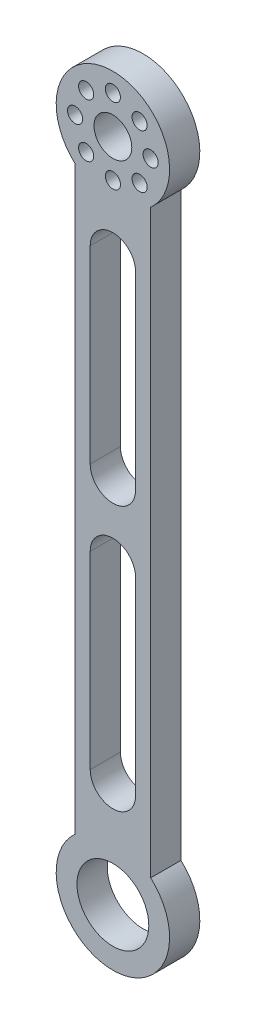
ISO-10303-21;
HEADER;
FILE_DESCRIPTION(('STEP AP214'),'2;1');
FILE_NAME('part.step','',(''),(''),'','','');
FILE_SCHEMA(('AUTOMOTIVE_DESIGN { 1 0 10303 214 1 1 1 1 }'));
ENDSEC;
DATA;
#1=APPLICATION_CONTEXT('core data for automotive mechanical design processes');
#2=APPLICATION_PROTOCOL_DEFINITION('international standard','automotive_design',2000,#1);
#3=PRODUCT_CONTEXT('',#1,'mechanical');
#4=PRODUCT('Part','Part','',(#3));
#5=PRODUCT_RELATED_PRODUCT_CATEGORY('part','',(#4));
#6=PRODUCT_DEFINITION_FORMATION('','',#4);
#7=PRODUCT_DEFINITION_CONTEXT('part definition',#1,'design');
#8=PRODUCT_DEFINITION('design','',#6,#7);
#9=PRODUCT_DEFINITION_SHAPE('','',#8);
#10=(LENGTH_UNIT() NAMED_UNIT(*) SI_UNIT(.MILLI.,.METRE.));
#11=(NAMED_UNIT(*) PLANE_ANGLE_UNIT() SI_UNIT($,.RADIAN.));
#12=(NAMED_UNIT(*) SI_UNIT($,.STERADIAN.) SOLID_ANGLE_UNIT());
#13=UNCERTAINTY_MEASURE_WITH_UNIT(LENGTH_MEASURE(1.E-05),#10,'distance_accuracy_value','');
#14=(GEOMETRIC_REPRESENTATION_CONTEXT(3) GLOBAL_UNCERTAINTY_ASSIGNED_CONTEXT((#13)) GLOBAL_UNIT_ASSIGNED_CONTEXT((#10,
#11,#12)) REPRESENTATION_CONTEXT('',''));
#15=CARTESIAN_POINT('',(0.,0.,0.));
#16=DIRECTION('',(0.,0.,1.));
#17=DIRECTION('',(1.,0.,0.));
#18=AXIS2_PLACEMENT_3D('',#15,#16,#17);
#19=CARTESIAN_POINT('',(6.,0.,-2.));
#20=DIRECTION('',(1.,0.,0.));
#21=DIRECTION('',(0.,0.,-1.));
#22=AXIS2_PLACEMENT_3D('',#19,#20,#21);
#23=PLANE('',#22);
#24=DIRECTION('',(0.,0.,1.));
#25=VECTOR('',#24,1.);
#26=CARTESIAN_POINT('',(6.,10.,0.));
#27=LINE('',#26,#25);
#28=CARTESIAN_POINT('',(6.,9.99999999999999,0.));
#29=VERTEX_POINT('',#28);
#30=CARTESIAN_POINT('',(6.,10.,8.));
#31=VERTEX_POINT('',#30);
#32=EDGE_CURVE('E133',#29,#31,#27,.T.);
#33=ORIENTED_EDGE('',*,*,#32,.T.);
#34=DIRECTION('',(0.,1.,0.));
#35=VECTOR('',#34,1.);
#36=CARTESIAN_POINT('',(6.,0.,8.));
#37=LINE('',#36,#35);
#38=CARTESIAN_POINT('',(6.,60.,8.));
#39=VERTEX_POINT('',#38);
#40=EDGE_CURVE('E171',#31,#39,#37,.T.);
#41=ORIENTED_EDGE('',*,*,#40,.T.);
#42=DIRECTION('',(0.,0.,1.));
#43=VECTOR('',#42,1.);
#44=CARTESIAN_POINT('',(6.,60.,-2.));
#45=LINE('',#44,#43);
#46=CARTESIAN_POINT('',(6.,60.,0.));
#47=VERTEX_POINT('',#46);
#48=EDGE_CURVE('E168',#47,#39,#45,.T.);
#49=ORIENTED_EDGE('',*,*,#48,.F.);
#50=DIRECTION('',(0.,1.,0.));
#51=VECTOR('',#50,1.);
#52=CARTESIAN_POINT('',(6.,-87.9999999999999,0.));
#53=LINE('',#52,#51);
#54=EDGE_CURVE('E52',#29,#47,#53,.T.);
#55=ORIENTED_EDGE('',*,*,#54,.F.);
#56=EDGE_LOOP('',(#33,#41,#49,#55));
#57=FACE_BOUND('',#56,.T.);
#58=ADVANCED_FACE('F37',(#57),#23,.F.);
#59=CARTESIAN_POINT('',(-6.,0.,-2.));
#60=DIRECTION('',(1.,0.,0.));
#61=DIRECTION('',(0.,0.,-1.));
#62=AXIS2_PLACEMENT_3D('',#59,#60,#61);
#63=PLANE('',#62);
#64=DIRECTION('',(0.,1.,0.));
#65=VECTOR('',#64,1.);
#66=CARTESIAN_POINT('',(-6.,0.,8.));
#67=LINE('',#66,#65);
#68=CARTESIAN_POINT('',(-6.,10.,8.));
#69=VERTEX_POINT('',#68);
#70=CARTESIAN_POINT('',(-6.,60.,8.));
#71=VERTEX_POINT('',#70);
#72=EDGE_CURVE('E144',#69,#71,#67,.T.);
#73=ORIENTED_EDGE('',*,*,#72,.F.);
#74=DIRECTION('',(0.,0.,1.));
#75=VECTOR('',#74,1.);
#76=CARTESIAN_POINT('',(-6.,10.,0.));
#77=LINE('',#76,#75);
#78=CARTESIAN_POINT('',(-6.,10.,0.));
#79=VERTEX_POINT('',#78);
#80=EDGE_CURVE('E131',#79,#69,#77,.T.);
#81=ORIENTED_EDGE('',*,*,#80,.F.);
#82=DIRECTION('',(0.,1.,0.));
#83=VECTOR('',#82,1.);
#84=CARTESIAN_POINT('',(-6.,-87.9999999999999,0.));
#85=LINE('',#84,#83);
#86=CARTESIAN_POINT('',(-6.,60.,0.));
#87=VERTEX_POINT('',#86);
#88=EDGE_CURVE('E142',#79,#87,#85,.T.);
#89=ORIENTED_EDGE('',*,*,#88,.T.);
#90=DIRECTION('',(0.,0.,1.));
#91=VECTOR('',#90,1.);
#92=CARTESIAN_POINT('',(-6.,60.,-2.));
#93=LINE('',#92,#91);
#94=EDGE_CURVE('E170',#87,#71,#93,.T.);
#95=ORIENTED_EDGE('',*,*,#94,.T.);
#96=EDGE_LOOP('',(#73,#81,#89,#95));
#97=FACE_BOUND('',#96,.T.);
#98=ADVANCED_FACE('F140',(#97),#63,.T.);
#99=CARTESIAN_POINT('',(0.,-87.9999999999999,8.));
#100=DIRECTION('',(0.,0.,1.));
#101=DIRECTION('',(1.,0.,0.));
#102=AXIS2_PLACEMENT_3D('',#99,#100,#101);
#103=PLANE('',#102);
#104=ORIENTED_EDGE('',*,*,#40,.F.);
#105=CARTESIAN_POINT('',(0.,10.,8.));
#106=DIRECTION('',(0.,0.,-1.));
#107=DIRECTION('',(1.,0.,0.));
#108=AXIS2_PLACEMENT_3D('',#105,#106,#107);
#109=CIRCLE('',#108,6.);
#110=EDGE_CURVE('E326',#31,#69,#109,.T.);
#111=ORIENTED_EDGE('',*,*,#110,.T.);
#112=ORIENTED_EDGE('',*,*,#72,.T.);
#113=CARTESIAN_POINT('',(0.,60.,8.));
#114=DIRECTION('',(0.,0.,1.));
#115=DIRECTION('',(1.,0.,0.));
#116=AXIS2_PLACEMENT_3D('',#113,#114,#115);
#117=CIRCLE('',#116,6.);
#118=EDGE_CURVE('E331',#71,#39,#117,.F.);
#119=ORIENTED_EDGE('',*,*,#118,.T.);
#120=EDGE_LOOP('',(#104,#111,#112,#119));
#121=FACE_BOUND('',#120,.T.);
#122=CARTESIAN_POINT('',(0.,88.0000000000001,8.));
#123=DIRECTION('',(0.,0.,1.));
#124=DIRECTION('',(1.,0.,0.));
#125=AXIS2_PLACEMENT_3D('',#122,#123,#124);
#126=CIRCLE('',#125,5.00000000000001);
#127=CARTESIAN_POINT('',(5.,88.0000000000001,8.));
#128=VERTEX_POINT('',#127);
#129=EDGE_CURVE('E172',#128,#128,#126,.T.);
#130=ORIENTED_EDGE('',*,*,#129,.F.);
#131=EDGE_LOOP('',(#130));
#132=FACE_BOUND('',#131,.T.);
#133=CARTESIAN_POINT('',(7.0710678118653,95.0710678118657,8.));
#134=DIRECTION('',(0.,0.,1.));
#135=DIRECTION('',(1.,0.,0.));
#136=AXIS2_PLACEMENT_3D('',#133,#134,#135);
#137=CIRCLE('',#136,2.);
#138=CARTESIAN_POINT('',(9.0710678118653,95.0710678118657,8.));
#139=VERTEX_POINT('',#138);
#140=EDGE_CURVE('E211',#139,#139,#137,.T.);
#141=ORIENTED_EDGE('',*,*,#140,.F.);
#142=EDGE_LOOP('',(#141));
#143=FACE_BOUND('',#142,.T.);
#144=CARTESIAN_POINT('',(9.99999999999999,88.0000000000001,8.));
#145=DIRECTION('',(0.,0.,1.));
#146=DIRECTION('',(1.,0.,0.));
#147=AXIS2_PLACEMENT_3D('',#144,#145,#146);
#148=CIRCLE('',#147,1.99999999999987);
#149=CARTESIAN_POINT('',(11.9999999999999,88.0000000000001,8.));
#150=VERTEX_POINT('',#149);
#151=EDGE_CURVE('E217',#150,#150,#148,.T.);
#152=ORIENTED_EDGE('',*,*,#151,.F.);
#153=EDGE_LOOP('',(#152));
#154=FACE_BOUND('',#153,.T.);
#155=CARTESIAN_POINT('',(0.,78.0000000000001,8.));
#156=DIRECTION('',(0.,0.,1.));
#157=DIRECTION('',(1.,0.,0.));
#158=AXIS2_PLACEMENT_3D('',#155,#156,#157);
#159=CIRCLE('',#158,2.);
#160=CARTESIAN_POINT('',(2.,78.0000000000001,8.));
#161=VERTEX_POINT('',#160);
#162=EDGE_CURVE('E223',#161,#161,#159,.T.);
#163=ORIENTED_EDGE('',*,*,#162,.F.);
#164=EDGE_LOOP('',(#163));
#165=FACE_BOUND('',#164,.T.);
#166=CARTESIAN_POINT('',(-10.,88.0000000000001,8.));
#167=DIRECTION('',(0.,0.,1.));
#168=DIRECTION('',(1.,0.,0.));
#169=AXIS2_PLACEMENT_3D('',#166,#167,#168);
#170=CIRCLE('',#169,1.99999999999992);
#171=CARTESIAN_POINT('',(-8.00000000000008,88.0000000000001,8.));
#172=VERTEX_POINT('',#171);
#173=EDGE_CURVE('E192',#172,#172,#170,.T.);
#174=ORIENTED_EDGE('',*,*,#173,.F.);
#175=EDGE_LOOP('',(#174));
#176=FACE_BOUND('',#175,.T.);
#177=CARTESIAN_POINT('',(7.07106781186564,80.9289321881348,8.));
#178=DIRECTION('',(0.,0.,1.));
#179=DIRECTION('',(1.,0.,0.));
#180=AXIS2_PLACEMENT_3D('',#177,#178,#179);
#181=CIRCLE('',#180,2.00000000000009);
#182=CARTESIAN_POINT('',(9.07106781186572,80.9289321881348,8.));
#183=VERTEX_POINT('',#182);
#184=EDGE_CURVE('E193',#183,#183,#181,.T.);
#185=ORIENTED_EDGE('',*,*,#184,.F.);
#186=EDGE_LOOP('',(#185));
#187=FACE_BOUND('',#186,.T.);
#188=CARTESIAN_POINT('',(-7.07106781186532,80.9289321881344,8.));
#189=DIRECTION('',(0.,0.,1.));
#190=DIRECTION('',(1.,0.,0.));
#191=AXIS2_PLACEMENT_3D('',#188,#189,#190);
#192=CIRCLE('',#191,2.00000000000001);
#193=CARTESIAN_POINT('',(-5.07106781186531,80.9289321881344,8.));
#194=VERTEX_POINT('',#193);
#195=EDGE_CURVE('E199',#194,#194,#192,.T.);
#196=ORIENTED_EDGE('',*,*,#195,.F.);
#197=EDGE_LOOP('',(#196));
#198=FACE_BOUND('',#197,.T.);
#199=CARTESIAN_POINT('',(-7.07106781186565,95.0710678118654,8.));
#200=DIRECTION('',(0.,0.,1.));
#201=DIRECTION('',(1.,0.,0.));
#202=AXIS2_PLACEMENT_3D('',#199,#200,#201);
#203=CIRCLE('',#202,1.99999999999983);
#204=CARTESIAN_POINT('',(-5.07106781186583,95.0710678118654,8.));
#205=VERTEX_POINT('',#204);
#206=EDGE_CURVE('E187',#205,#205,#203,.T.);
#207=ORIENTED_EDGE('',*,*,#206,.F.);
#208=EDGE_LOOP('',(#207));
#209=FACE_BOUND('',#208,.T.);
#210=CARTESIAN_POINT('',(0.,98.0000000000001,8.));
#211=DIRECTION('',(0.,0.,1.));
#212=DIRECTION('',(1.,0.,0.));
#213=AXIS2_PLACEMENT_3D('',#210,#211,#212);
#214=CIRCLE('',#213,2.);
#215=CARTESIAN_POINT('',(2.,98.0000000000001,8.));
#216=VERTEX_POINT('',#215);
#217=EDGE_CURVE('E210',#216,#216,#214,.T.);
#218=ORIENTED_EDGE('',*,*,#217,.F.);
#219=EDGE_LOOP('',(#218));
#220=FACE_BOUND('',#219,.T.);
#221=CARTESIAN_POINT('',(0.,-87.9999999999999,8.));
#222=DIRECTION('',(0.,0.,1.));
#223=DIRECTION('',(1.,0.,0.));
#224=AXIS2_PLACEMENT_3D('',#221,#222,#223);
#225=CIRCLE('',#224,15.);
#226=CARTESIAN_POINT('',(-9.99999999999999,-76.819660112501,8.));
#227=VERTEX_POINT('',#226);
#228=CARTESIAN_POINT('',(10.,-76.819660112501,8.));
#229=VERTEX_POINT('',#228);
#230=EDGE_CURVE('E243',#227,#229,#225,.T.);
#231=ORIENTED_EDGE('',*,*,#230,.T.);
#232=DIRECTION('',(0.,1.,0.));
#233=VECTOR('',#232,1.);
#234=CARTESIAN_POINT('',(9.99999999999999,76.8196601125011,8.));
#235=LINE('',#234,#233);
#236=CARTESIAN_POINT('',(9.99999999999999,76.8196601125011,8.));
#237=VERTEX_POINT('',#236);
#238=EDGE_CURVE('E246',#229,#237,#235,.T.);
#239=ORIENTED_EDGE('',*,*,#238,.T.);
#240=CARTESIAN_POINT('',(0.,88.0000000000001,8.));
#241=DIRECTION('',(0.,0.,1.));
#242=DIRECTION('',(1.,0.,0.));
#243=AXIS2_PLACEMENT_3D('',#240,#241,#242);
#244=CIRCLE('',#243,15.);
#245=CARTESIAN_POINT('',(-10.,76.8196601125011,8.));
#246=VERTEX_POINT('',#245);
#247=EDGE_CURVE('E249',#237,#246,#244,.T.);
#248=ORIENTED_EDGE('',*,*,#247,.T.);
#249=DIRECTION('',(0.,-1.,0.));
#250=VECTOR('',#249,1.);
#251=CARTESIAN_POINT('',(-10.,76.8196601125011,8.));
#252=LINE('',#251,#250);
#253=EDGE_CURVE('E251',#246,#227,#252,.T.);
#254=ORIENTED_EDGE('',*,*,#253,.T.);
#255=EDGE_LOOP('',(#231,#239,#248,#254));
#256=FACE_BOUND('',#255,.T.);
#257=CARTESIAN_POINT('',(0.,-87.9999999999999,8.));
#258=DIRECTION('',(0.,0.,1.));
#259=DIRECTION('',(1.,0.,0.));
#260=AXIS2_PLACEMENT_3D('',#257,#258,#259);
#261=CIRCLE('',#260,9.49999999999998);
#262=CARTESIAN_POINT('',(9.49999999999999,-87.9999999999999,8.));
#263=VERTEX_POINT('',#262);
#264=EDGE_CURVE('E237',#263,#263,#261,.T.);
#265=ORIENTED_EDGE('',*,*,#264,.F.);
#266=EDGE_LOOP('',(#265));
#267=FACE_BOUND('',#266,.T.);
#268=CARTESIAN_POINT('',(-6.,-60.,8.));
#269=VERTEX_POINT('',#268);
#270=CARTESIAN_POINT('',(-6.,-10.,8.));
#271=VERTEX_POINT('',#270);
#272=EDGE_CURVE('E325',#269,#271,#67,.T.);
#273=ORIENTED_EDGE('',*,*,#272,.T.);
#274=CARTESIAN_POINT('',(0.,-10.,8.));
#275=DIRECTION('',(0.,0.,-1.));
#276=DIRECTION('',(1.,0.,0.));
#277=AXIS2_PLACEMENT_3D('',#274,#275,#276);
#278=CIRCLE('',#277,6.);
#279=CARTESIAN_POINT('',(6.,-10.,8.));
#280=VERTEX_POINT('',#279);
#281=EDGE_CURVE('E137',#271,#280,#278,.T.);
#282=ORIENTED_EDGE('',*,*,#281,.T.);
#283=CARTESIAN_POINT('',(6.,-60.,8.));
#284=VERTEX_POINT('',#283);
#285=EDGE_CURVE('E181',#284,#280,#37,.T.);
#286=ORIENTED_EDGE('',*,*,#285,.F.);
#287=CARTESIAN_POINT('',(0.,-60.,8.));
#288=DIRECTION('',(0.,0.,1.));
#289=DIRECTION('',(1.,0.,0.));
#290=AXIS2_PLACEMENT_3D('',#287,#288,#289);
#291=CIRCLE('',#290,6.);
#292=EDGE_CURVE('E335',#269,#284,#291,.T.);
#293=ORIENTED_EDGE('',*,*,#292,.F.);
#294=EDGE_LOOP('',(#273,#282,#286,#293));
#295=FACE_BOUND('',#294,.T.);
#296=ADVANCED_FACE('F285',(#121,#132,#143,#154,#165,#176,#187,#198,#209,#220,#256,#267,#295),
#103,.T.);
#297=CARTESIAN_POINT('',(0.,-87.9999999999999,0.));
#298=DIRECTION('',(0.,0.,1.));
#299=DIRECTION('',(1.,0.,0.));
#300=AXIS2_PLACEMENT_3D('',#297,#298,#299);
#301=PLANE('',#300);
#302=CARTESIAN_POINT('',(0.,10.,0.));
#303=DIRECTION('',(0.,0.,-1.));
#304=DIRECTION('',(1.,0.,0.));
#305=AXIS2_PLACEMENT_3D('',#302,#303,#304);
#306=CIRCLE('',#305,6.);
#307=EDGE_CURVE('E127',#29,#79,#306,.T.);
#308=ORIENTED_EDGE('',*,*,#307,.F.);
#309=ORIENTED_EDGE('',*,*,#54,.T.);
#310=CARTESIAN_POINT('',(0.,60.,0.));
#311=DIRECTION('',(0.,0.,1.));
#312=DIRECTION('',(1.,0.,0.));
#313=AXIS2_PLACEMENT_3D('',#310,#311,#312);
#314=CIRCLE('',#313,6.);
#315=EDGE_CURVE('E11',#87,#47,#314,.F.);
#316=ORIENTED_EDGE('',*,*,#315,.F.);
#317=ORIENTED_EDGE('',*,*,#88,.F.);
#318=EDGE_LOOP('',(#308,#309,#316,#317));
#319=FACE_BOUND('',#318,.T.);
#320=CARTESIAN_POINT('',(0.,-87.9999999999999,0.));
#321=DIRECTION('',(0.,0.,1.));
#322=DIRECTION('',(1.,0.,0.));
#323=AXIS2_PLACEMENT_3D('',#320,#321,#322);
#324=CIRCLE('',#323,9.49999999999998);
#325=CARTESIAN_POINT('',(9.49999999999999,-87.9999999999999,0.));
#326=VERTEX_POINT('',#325);
#327=EDGE_CURVE('E234',#326,#326,#324,.T.);
#328=ORIENTED_EDGE('',*,*,#327,.T.);
#329=EDGE_LOOP('',(#328));
#330=FACE_BOUND('',#329,.T.);
#331=CARTESIAN_POINT('',(0.,-87.9999999999999,0.));
#332=DIRECTION('',(0.,0.,1.));
#333=DIRECTION('',(1.,0.,0.));
#334=AXIS2_PLACEMENT_3D('',#331,#332,#333);
#335=CIRCLE('',#334,15.);
#336=CARTESIAN_POINT('',(-9.99999999999999,-76.819660112501,0.));
#337=VERTEX_POINT('',#336);
#338=CARTESIAN_POINT('',(10.,-76.819660112501,0.));
#339=VERTEX_POINT('',#338);
#340=EDGE_CURVE('E240',#337,#339,#335,.T.);
#341=ORIENTED_EDGE('',*,*,#340,.F.);
#342=DIRECTION('',(0.,-1.,0.));
#343=VECTOR('',#342,1.);
#344=CARTESIAN_POINT('',(-10.,76.8196601125011,0.));
#345=LINE('',#344,#343);
#346=CARTESIAN_POINT('',(-10.,76.8196601125011,0.));
#347=VERTEX_POINT('',#346);
#348=EDGE_CURVE('E247',#347,#337,#345,.T.);
#349=ORIENTED_EDGE('',*,*,#348,.F.);
#350=CARTESIAN_POINT('',(0.,88.0000000000001,0.));
#351=DIRECTION('',(0.,0.,1.));
#352=DIRECTION('',(1.,0.,0.));
#353=AXIS2_PLACEMENT_3D('',#350,#351,#352);
#354=CIRCLE('',#353,15.);
#355=CARTESIAN_POINT('',(9.99999999999999,76.8196601125011,0.));
#356=VERTEX_POINT('',#355);
#357=EDGE_CURVE('E258',#356,#347,#354,.T.);
#358=ORIENTED_EDGE('',*,*,#357,.F.);
#359=DIRECTION('',(0.,1.,0.));
#360=VECTOR('',#359,1.);
#361=CARTESIAN_POINT('',(9.99999999999999,76.8196601125011,0.));
#362=LINE('',#361,#360);
#363=EDGE_CURVE('E256',#339,#356,#362,.T.);
#364=ORIENTED_EDGE('',*,*,#363,.F.);
#365=EDGE_LOOP('',(#341,#349,#358,#364));
#366=FACE_BOUND('',#365,.T.);
#367=CARTESIAN_POINT('',(0.,98.0000000000001,0.));
#368=DIRECTION('',(0.,0.,1.));
#369=DIRECTION('',(1.,0.,0.));
#370=AXIS2_PLACEMENT_3D('',#367,#368,#369);
#371=CIRCLE('',#370,2.);
#372=CARTESIAN_POINT('',(2.,98.0000000000001,0.));
#373=VERTEX_POINT('',#372);
#374=EDGE_CURVE('E231',#373,#373,#371,.T.);
#375=ORIENTED_EDGE('',*,*,#374,.T.);
#376=EDGE_LOOP('',(#375));
#377=FACE_BOUND('',#376,.T.);
#378=CARTESIAN_POINT('',(-7.07106781186565,95.0710678118654,0.));
#379=DIRECTION('',(0.,0.,1.));
#380=DIRECTION('',(1.,0.,0.));
#381=AXIS2_PLACEMENT_3D('',#378,#379,#380);
#382=CIRCLE('',#381,1.99999999999983);
#383=CARTESIAN_POINT('',(-5.07106781186583,95.0710678118654,0.));
#384=VERTEX_POINT('',#383);
#385=EDGE_CURVE('E202',#384,#384,#382,.T.);
#386=ORIENTED_EDGE('',*,*,#385,.T.);
#387=EDGE_LOOP('',(#386));
#388=FACE_BOUND('',#387,.T.);
#389=CARTESIAN_POINT('',(-7.07106781186532,80.9289321881344,0.));
#390=DIRECTION('',(0.,0.,1.));
#391=DIRECTION('',(1.,0.,0.));
#392=AXIS2_PLACEMENT_3D('',#389,#390,#391);
#393=CIRCLE('',#392,2.00000000000001);
#394=CARTESIAN_POINT('',(-5.07106781186531,80.9289321881344,0.));
#395=VERTEX_POINT('',#394);
#396=EDGE_CURVE('E196',#395,#395,#393,.T.);
#397=ORIENTED_EDGE('',*,*,#396,.T.);
#398=EDGE_LOOP('',(#397));
#399=FACE_BOUND('',#398,.T.);
#400=CARTESIAN_POINT('',(7.07106781186564,80.9289321881348,0.));
#401=DIRECTION('',(0.,0.,1.));
#402=DIRECTION('',(1.,0.,0.));
#403=AXIS2_PLACEMENT_3D('',#400,#401,#402);
#404=CIRCLE('',#403,2.00000000000009);
#405=CARTESIAN_POINT('',(9.07106781186572,80.9289321881348,0.));
#406=VERTEX_POINT('',#405);
#407=EDGE_CURVE('E189',#406,#406,#404,.T.);
#408=ORIENTED_EDGE('',*,*,#407,.T.);
#409=EDGE_LOOP('',(#408));
#410=FACE_BOUND('',#409,.T.);
#411=CARTESIAN_POINT('',(-10.,88.0000000000001,0.));
#412=DIRECTION('',(0.,0.,1.));
#413=DIRECTION('',(1.,0.,0.));
#414=AXIS2_PLACEMENT_3D('',#411,#412,#413);
#415=CIRCLE('',#414,1.99999999999992);
#416=CARTESIAN_POINT('',(-8.00000000000008,88.0000000000001,0.));
#417=VERTEX_POINT('',#416);
#418=EDGE_CURVE('E226',#417,#417,#415,.T.);
#419=ORIENTED_EDGE('',*,*,#418,.T.);
#420=EDGE_LOOP('',(#419));
#421=FACE_BOUND('',#420,.T.);
#422=CARTESIAN_POINT('',(0.,78.0000000000001,0.));
#423=DIRECTION('',(0.,0.,1.));
#424=DIRECTION('',(1.,0.,0.));
#425=AXIS2_PLACEMENT_3D('',#422,#423,#424);
#426=CIRCLE('',#425,2.);
#427=CARTESIAN_POINT('',(2.,78.0000000000001,0.));
#428=VERTEX_POINT('',#427);
#429=EDGE_CURVE('E220',#428,#428,#426,.T.);
#430=ORIENTED_EDGE('',*,*,#429,.T.);
#431=EDGE_LOOP('',(#430));
#432=FACE_BOUND('',#431,.T.);
#433=CARTESIAN_POINT('',(9.99999999999999,88.0000000000001,0.));
#434=DIRECTION('',(0.,0.,1.));
#435=DIRECTION('',(1.,0.,0.));
#436=AXIS2_PLACEMENT_3D('',#433,#434,#435);
#437=CIRCLE('',#436,1.99999999999987);
#438=CARTESIAN_POINT('',(11.9999999999999,88.0000000000001,0.));
#439=VERTEX_POINT('',#438);
#440=EDGE_CURVE('E214',#439,#439,#437,.T.);
#441=ORIENTED_EDGE('',*,*,#440,.T.);
#442=EDGE_LOOP('',(#441));
#443=FACE_BOUND('',#442,.T.);
#444=CARTESIAN_POINT('',(7.0710678118653,95.0710678118657,0.));
#445=DIRECTION('',(0.,0.,1.));
#446=DIRECTION('',(1.,0.,0.));
#447=AXIS2_PLACEMENT_3D('',#444,#445,#446);
#448=CIRCLE('',#447,2.);
#449=CARTESIAN_POINT('',(9.0710678118653,95.0710678118657,0.));
#450=VERTEX_POINT('',#449);
#451=EDGE_CURVE('E207',#450,#450,#448,.T.);
#452=ORIENTED_EDGE('',*,*,#451,.T.);
#453=EDGE_LOOP('',(#452));
#454=FACE_BOUND('',#453,.T.);
#455=CARTESIAN_POINT('',(0.,88.0000000000001,0.));
#456=DIRECTION('',(0.,0.,1.));
#457=DIRECTION('',(1.,0.,0.));
#458=AXIS2_PLACEMENT_3D('',#455,#456,#457);
#459=CIRCLE('',#458,5.00000000000001);
#460=CARTESIAN_POINT('',(5.,88.0000000000001,0.));
#461=VERTEX_POINT('',#460);
#462=EDGE_CURVE('E176',#461,#461,#459,.T.);
#463=ORIENTED_EDGE('',*,*,#462,.T.);
#464=EDGE_LOOP('',(#463));
#465=FACE_BOUND('',#464,.T.);
#466=CARTESIAN_POINT('',(6.,-60.,0.));
#467=VERTEX_POINT('',#466);
#468=CARTESIAN_POINT('',(6.,-9.99999999999999,0.));
#469=VERTEX_POINT('',#468);
#470=EDGE_CURVE('E45',#467,#469,#53,.T.);
#471=ORIENTED_EDGE('',*,*,#470,.T.);
#472=CARTESIAN_POINT('',(0.,-10.,0.));
#473=DIRECTION('',(0.,0.,-1.));
#474=DIRECTION('',(1.,0.,0.));
#475=AXIS2_PLACEMENT_3D('',#472,#473,#474);
#476=CIRCLE('',#475,6.);
#477=CARTESIAN_POINT('',(-6.,-10.,0.));
#478=VERTEX_POINT('',#477);
#479=EDGE_CURVE('E136',#478,#469,#476,.T.);
#480=ORIENTED_EDGE('',*,*,#479,.F.);
#481=CARTESIAN_POINT('',(-6.,-60.,0.));
#482=VERTEX_POINT('',#481);
#483=EDGE_CURVE('E150',#482,#478,#85,.T.);
#484=ORIENTED_EDGE('',*,*,#483,.F.);
#485=CARTESIAN_POINT('',(0.,-60.,0.));
#486=DIRECTION('',(0.,0.,1.));
#487=DIRECTION('',(1.,0.,0.));
#488=AXIS2_PLACEMENT_3D('',#485,#486,#487);
#489=CIRCLE('',#488,6.);
#490=EDGE_CURVE('E154',#482,#467,#489,.T.);
#491=ORIENTED_EDGE('',*,*,#490,.T.);
#492=EDGE_LOOP('',(#471,#480,#484,#491));
#493=FACE_BOUND('',#492,.T.);
#494=ADVANCED_FACE('F148',(#319,#330,#366,#377,#388,#399,#410,#421,#432,#443,#454,#465,#493),
#301,.F.);
#495=CARTESIAN_POINT('',(0.,-87.9999999999999,8.));
#496=DIRECTION('',(0.,0.,-1.));
#497=DIRECTION('',(-1.,0.,0.));
#498=AXIS2_PLACEMENT_3D('',#495,#496,#497);
#499=CYLINDRICAL_SURFACE('',#498,15.);
#500=ORIENTED_EDGE('',*,*,#340,.T.);
#501=DIRECTION('',(0.,0.,-1.));
#502=VECTOR('',#501,1.);
#503=CARTESIAN_POINT('',(10.,-76.819660112501,8.));
#504=LINE('',#503,#502);
#505=EDGE_CURVE('E151',#229,#339,#504,.T.);
#506=ORIENTED_EDGE('',*,*,#505,.F.);
#507=ORIENTED_EDGE('',*,*,#230,.F.);
#508=DIRECTION('',(0.,0.,-1.));
#509=VECTOR('',#508,1.);
#510=CARTESIAN_POINT('',(-9.99999999999999,-76.819660112501,8.));
#511=LINE('',#510,#509);
#512=EDGE_CURVE('E253',#227,#337,#511,.T.);
#513=ORIENTED_EDGE('',*,*,#512,.T.);
#514=EDGE_LOOP('',(#500,#506,#507,#513));
#515=FACE_BOUND('',#514,.T.);
#516=ADVANCED_FACE('F39',(#515),#499,.T.);
#517=CARTESIAN_POINT('',(9.99999999999999,76.8196601125011,8.));
#518=DIRECTION('',(-1.,0.,0.));
#519=DIRECTION('',(0.,-1.,0.));
#520=AXIS2_PLACEMENT_3D('',#517,#518,#519);
#521=PLANE('',#520);
#522=ORIENTED_EDGE('',*,*,#363,.T.);
#523=DIRECTION('',(0.,0.,-1.));
#524=VECTOR('',#523,1.);
#525=CARTESIAN_POINT('',(9.99999999999999,76.8196601125011,8.));
#526=LINE('',#525,#524);
#527=EDGE_CURVE('E156',#237,#356,#526,.T.);
#528=ORIENTED_EDGE('',*,*,#527,.F.);
#529=ORIENTED_EDGE('',*,*,#238,.F.);
#530=ORIENTED_EDGE('',*,*,#505,.T.);
#531=EDGE_LOOP('',(#522,#528,#529,#530));
#532=FACE_BOUND('',#531,.T.);
#533=ADVANCED_FACE('F287',(#532),#521,.F.);
#534=CARTESIAN_POINT('',(0.,88.0000000000001,8.));
#535=DIRECTION('',(0.,0.,-1.));
#536=DIRECTION('',(-1.,0.,0.));
#537=AXIS2_PLACEMENT_3D('',#534,#535,#536);
#538=CYLINDRICAL_SURFACE('',#537,15.);
#539=ORIENTED_EDGE('',*,*,#357,.T.);
#540=DIRECTION('',(0.,0.,-1.));
#541=VECTOR('',#540,1.);
#542=CARTESIAN_POINT('',(-10.,76.8196601125011,8.));
#543=LINE('',#542,#541);
#544=EDGE_CURVE('E263',#246,#347,#543,.T.);
#545=ORIENTED_EDGE('',*,*,#544,.F.);
#546=ORIENTED_EDGE('',*,*,#247,.F.);
#547=ORIENTED_EDGE('',*,*,#527,.T.);
#548=EDGE_LOOP('',(#539,#545,#546,#547));
#549=FACE_BOUND('',#548,.T.);
#550=ADVANCED_FACE('F270',(#549),#538,.T.);
#551=CARTESIAN_POINT('',(-10.,76.8196601125011,8.));
#552=DIRECTION('',(1.,0.,0.));
#553=DIRECTION('',(0.,1.,0.));
#554=AXIS2_PLACEMENT_3D('',#551,#552,#553);
#555=PLANE('',#554);
#556=ORIENTED_EDGE('',*,*,#348,.T.);
#557=ORIENTED_EDGE('',*,*,#512,.F.);
#558=ORIENTED_EDGE('',*,*,#253,.F.);
#559=ORIENTED_EDGE('',*,*,#544,.T.);
#560=EDGE_LOOP('',(#556,#557,#558,#559));
#561=FACE_BOUND('',#560,.T.);
#562=ADVANCED_FACE('F279',(#561),#555,.F.);
#563=CARTESIAN_POINT('',(0.,-87.9999999999999,8.));
#564=DIRECTION('',(0.,0.,-1.));
#565=DIRECTION('',(-1.,0.,0.));
#566=AXIS2_PLACEMENT_3D('',#563,#564,#565);
#567=CYLINDRICAL_SURFACE('',#566,9.49999999999998);
#568=ORIENTED_EDGE('',*,*,#264,.T.);
#569=EDGE_LOOP('',(#568));
#570=FACE_BOUND('',#569,.T.);
#571=ORIENTED_EDGE('',*,*,#327,.F.);
#572=EDGE_LOOP('',(#571));
#573=FACE_BOUND('',#572,.T.);
#574=ADVANCED_FACE('F349',(#570,#573),#567,.F.);
#575=CARTESIAN_POINT('',(0.,98.0000000000001,0.));
#576=DIRECTION('',(0.,0.,1.));
#577=DIRECTION('',(1.,0.,0.));
#578=AXIS2_PLACEMENT_3D('',#575,#576,#577);
#579=CYLINDRICAL_SURFACE('',#578,2.);
#580=ORIENTED_EDGE('',*,*,#374,.F.);
#581=EDGE_LOOP('',(#580));
#582=FACE_BOUND('',#581,.T.);
#583=ORIENTED_EDGE('',*,*,#217,.T.);
#584=EDGE_LOOP('',(#583));
#585=FACE_BOUND('',#584,.T.);
#586=ADVANCED_FACE('F353',(#582,#585),#579,.F.);
#587=CARTESIAN_POINT('',(-7.07106781186565,95.0710678118654,0.));
#588=DIRECTION('',(0.,0.,1.));
#589=DIRECTION('',(1.,0.,0.));
#590=AXIS2_PLACEMENT_3D('',#587,#588,#589);
#591=CYLINDRICAL_SURFACE('',#590,1.99999999999983);
#592=ORIENTED_EDGE('',*,*,#385,.F.);
#593=EDGE_LOOP('',(#592));
#594=FACE_BOUND('',#593,.T.);
#595=ORIENTED_EDGE('',*,*,#206,.T.);
#596=EDGE_LOOP('',(#595));
#597=FACE_BOUND('',#596,.T.);
#598=ADVANCED_FACE('F358',(#594,#597),#591,.F.);
#599=CARTESIAN_POINT('',(-7.07106781186532,80.9289321881344,0.));
#600=DIRECTION('',(0.,0.,1.));
#601=DIRECTION('',(1.,0.,0.));
#602=AXIS2_PLACEMENT_3D('',#599,#600,#601);
#603=CYLINDRICAL_SURFACE('',#602,2.00000000000001);
#604=ORIENTED_EDGE('',*,*,#396,.F.);
#605=EDGE_LOOP('',(#604));
#606=FACE_BOUND('',#605,.T.);
#607=ORIENTED_EDGE('',*,*,#195,.T.);
#608=EDGE_LOOP('',(#607));
#609=FACE_BOUND('',#608,.T.);
#610=ADVANCED_FACE('F382',(#606,#609),#603,.F.);
#611=CARTESIAN_POINT('',(7.07106781186564,80.9289321881348,0.));
#612=DIRECTION('',(0.,0.,1.));
#613=DIRECTION('',(1.,0.,0.));
#614=AXIS2_PLACEMENT_3D('',#611,#612,#613);
#615=CYLINDRICAL_SURFACE('',#614,2.00000000000009);
#616=ORIENTED_EDGE('',*,*,#407,.F.);
#617=EDGE_LOOP('',(#616));
#618=FACE_BOUND('',#617,.T.);
#619=ORIENTED_EDGE('',*,*,#184,.T.);
#620=EDGE_LOOP('',(#619));
#621=FACE_BOUND('',#620,.T.);
#622=ADVANCED_FACE('F367',(#618,#621),#615,.F.);
#623=CARTESIAN_POINT('',(-10.,88.0000000000001,0.));
#624=DIRECTION('',(0.,0.,1.));
#625=DIRECTION('',(1.,0.,0.));
#626=AXIS2_PLACEMENT_3D('',#623,#624,#625);
#627=CYLINDRICAL_SURFACE('',#626,1.99999999999992);
#628=ORIENTED_EDGE('',*,*,#418,.F.);
#629=EDGE_LOOP('',(#628));
#630=FACE_BOUND('',#629,.T.);
#631=ORIENTED_EDGE('',*,*,#173,.T.);
#632=EDGE_LOOP('',(#631));
#633=FACE_BOUND('',#632,.T.);
#634=ADVANCED_FACE('F363',(#630,#633),#627,.F.);
#635=CARTESIAN_POINT('',(0.,78.0000000000001,0.));
#636=DIRECTION('',(0.,0.,1.));
#637=DIRECTION('',(1.,0.,0.));
#638=AXIS2_PLACEMENT_3D('',#635,#636,#637);
#639=CYLINDRICAL_SURFACE('',#638,2.);
#640=ORIENTED_EDGE('',*,*,#429,.F.);
#641=EDGE_LOOP('',(#640));
#642=FACE_BOUND('',#641,.T.);
#643=ORIENTED_EDGE('',*,*,#162,.T.);
#644=EDGE_LOOP('',(#643));
#645=FACE_BOUND('',#644,.T.);
#646=ADVANCED_FACE('F366',(#642,#645),#639,.F.);
#647=CARTESIAN_POINT('',(9.99999999999999,88.0000000000001,0.));
#648=DIRECTION('',(0.,0.,1.));
#649=DIRECTION('',(1.,0.,0.));
#650=AXIS2_PLACEMENT_3D('',#647,#648,#649);
#651=CYLINDRICAL_SURFACE('',#650,1.99999999999987);
#652=ORIENTED_EDGE('',*,*,#440,.F.);
#653=EDGE_LOOP('',(#652));
#654=FACE_BOUND('',#653,.T.);
#655=ORIENTED_EDGE('',*,*,#151,.T.);
#656=EDGE_LOOP('',(#655));
#657=FACE_BOUND('',#656,.T.);
#658=ADVANCED_FACE('F371',(#654,#657),#651,.F.);
#659=CARTESIAN_POINT('',(7.0710678118653,95.0710678118657,0.));
#660=DIRECTION('',(0.,0.,1.));
#661=DIRECTION('',(1.,0.,0.));
#662=AXIS2_PLACEMENT_3D('',#659,#660,#661);
#663=CYLINDRICAL_SURFACE('',#662,2.);
#664=ORIENTED_EDGE('',*,*,#451,.F.);
#665=EDGE_LOOP('',(#664));
#666=FACE_BOUND('',#665,.T.);
#667=ORIENTED_EDGE('',*,*,#140,.T.);
#668=EDGE_LOOP('',(#667));
#669=FACE_BOUND('',#668,.T.);
#670=ADVANCED_FACE('F375',(#666,#669),#663,.F.);
#671=CARTESIAN_POINT('',(0.,88.0000000000001,0.));
#672=DIRECTION('',(0.,0.,1.));
#673=DIRECTION('',(1.,0.,0.));
#674=AXIS2_PLACEMENT_3D('',#671,#672,#673);
#675=CYLINDRICAL_SURFACE('',#674,5.00000000000001);
#676=ORIENTED_EDGE('',*,*,#462,.F.);
#677=EDGE_LOOP('',(#676));
#678=FACE_BOUND('',#677,.T.);
#679=ORIENTED_EDGE('',*,*,#129,.T.);
#680=EDGE_LOOP('',(#679));
#681=FACE_BOUND('',#680,.T.);
#682=ADVANCED_FACE('F311',(#678,#681),#675,.F.);
#683=CARTESIAN_POINT('',(0.,60.,-2.));
#684=DIRECTION('',(0.,0.,1.));
#685=DIRECTION('',(1.,0.,0.));
#686=AXIS2_PLACEMENT_3D('',#683,#684,#685);
#687=CYLINDRICAL_SURFACE('',#686,6.);
#688=ORIENTED_EDGE('',*,*,#315,.T.);
#689=ORIENTED_EDGE('',*,*,#48,.T.);
#690=ORIENTED_EDGE('',*,*,#118,.F.);
#691=ORIENTED_EDGE('',*,*,#94,.F.);
#692=EDGE_LOOP('',(#688,#689,#690,#691));
#693=FACE_BOUND('',#692,.T.);
#694=ADVANCED_FACE('F166',(#693),#687,.F.);
#695=ORIENTED_EDGE('',*,*,#285,.T.);
#696=DIRECTION('',(0.,0.,1.));
#697=VECTOR('',#696,1.);
#698=CARTESIAN_POINT('',(6.,-10.,0.));
#699=LINE('',#698,#697);
#700=EDGE_CURVE('E60',#469,#280,#699,.T.);
#701=ORIENTED_EDGE('',*,*,#700,.F.);
#702=ORIENTED_EDGE('',*,*,#470,.F.);
#703=DIRECTION('',(0.,0.,1.));
#704=VECTOR('',#703,1.);
#705=CARTESIAN_POINT('',(6.,-60.,-2.));
#706=LINE('',#705,#704);
#707=EDGE_CURVE('E173',#467,#284,#706,.T.);
#708=ORIENTED_EDGE('',*,*,#707,.T.);
#709=EDGE_LOOP('',(#695,#701,#702,#708));
#710=FACE_BOUND('',#709,.T.);
#711=ADVANCED_FACE('F296',(#710),#23,.F.);
#712=CARTESIAN_POINT('',(0.,-60.,-2.));
#713=DIRECTION('',(0.,0.,1.));
#714=DIRECTION('',(1.,0.,0.));
#715=AXIS2_PLACEMENT_3D('',#712,#713,#714);
#716=CYLINDRICAL_SURFACE('',#715,6.);
#717=DIRECTION('',(0.,0.,1.));
#718=VECTOR('',#717,1.);
#719=CARTESIAN_POINT('',(-6.,-60.,-2.));
#720=LINE('',#719,#718);
#721=EDGE_CURVE('E178',#482,#269,#720,.T.);
#722=ORIENTED_EDGE('',*,*,#721,.T.);
#723=ORIENTED_EDGE('',*,*,#292,.T.);
#724=ORIENTED_EDGE('',*,*,#707,.F.);
#725=ORIENTED_EDGE('',*,*,#490,.F.);
#726=EDGE_LOOP('',(#722,#723,#724,#725));
#727=FACE_BOUND('',#726,.T.);
#728=ADVANCED_FACE('F305',(#727),#716,.F.);
#729=DIRECTION('',(0.,0.,1.));
#730=VECTOR('',#729,1.);
#731=CARTESIAN_POINT('',(-6.,-10.,0.));
#732=LINE('',#731,#730);
#733=EDGE_CURVE('E145',#478,#271,#732,.T.);
#734=ORIENTED_EDGE('',*,*,#733,.T.);
#735=ORIENTED_EDGE('',*,*,#272,.F.);
#736=ORIENTED_EDGE('',*,*,#721,.F.);
#737=ORIENTED_EDGE('',*,*,#483,.T.);
#738=EDGE_LOOP('',(#734,#735,#736,#737));
#739=FACE_BOUND('',#738,.T.);
#740=ADVANCED_FACE('F301',(#739),#63,.T.);
#741=CARTESIAN_POINT('',(0.,10.,0.));
#742=DIRECTION('',(0.,0.,1.));
#743=DIRECTION('',(1.,0.,0.));
#744=AXIS2_PLACEMENT_3D('',#741,#742,#743);
#745=CYLINDRICAL_SURFACE('',#744,6.);
#746=ORIENTED_EDGE('',*,*,#110,.F.);
#747=ORIENTED_EDGE('',*,*,#32,.F.);
#748=ORIENTED_EDGE('',*,*,#307,.T.);
#749=ORIENTED_EDGE('',*,*,#80,.T.);
#750=EDGE_LOOP('',(#746,#747,#748,#749));
#751=FACE_BOUND('',#750,.T.);
#752=ADVANCED_FACE('F130',(#751),#745,.F.);
#753=CARTESIAN_POINT('',(0.,-10.,0.));
#754=DIRECTION('',(0.,0.,1.));
#755=DIRECTION('',(1.,0.,0.));
#756=AXIS2_PLACEMENT_3D('',#753,#754,#755);
#757=CYLINDRICAL_SURFACE('',#756,6.);
#758=ORIENTED_EDGE('',*,*,#281,.F.);
#759=ORIENTED_EDGE('',*,*,#733,.F.);
#760=ORIENTED_EDGE('',*,*,#479,.T.);
#761=ORIENTED_EDGE('',*,*,#700,.T.);
#762=EDGE_LOOP('',(#758,#759,#760,#761));
#763=FACE_BOUND('',#762,.T.);
#764=ADVANCED_FACE('F320',(#763),#757,.F.);
#765=CLOSED_SHELL('',(#58,#98,#296,#494,#516,#533,#550,#562,#574,#586,#598,#610,#622,#634,#646,
#658,#670,#682,#694,#711,#728,#740,#752,#764));
#766=MANIFOLD_SOLID_BREP('B2',#765);
#767=ADVANCED_BREP_SHAPE_REPRESENTATION('',(#18,#766),#14);
#768=SHAPE_DEFINITION_REPRESENTATION(#9,#767);
ENDSEC;
END-ISO-10303-21;
